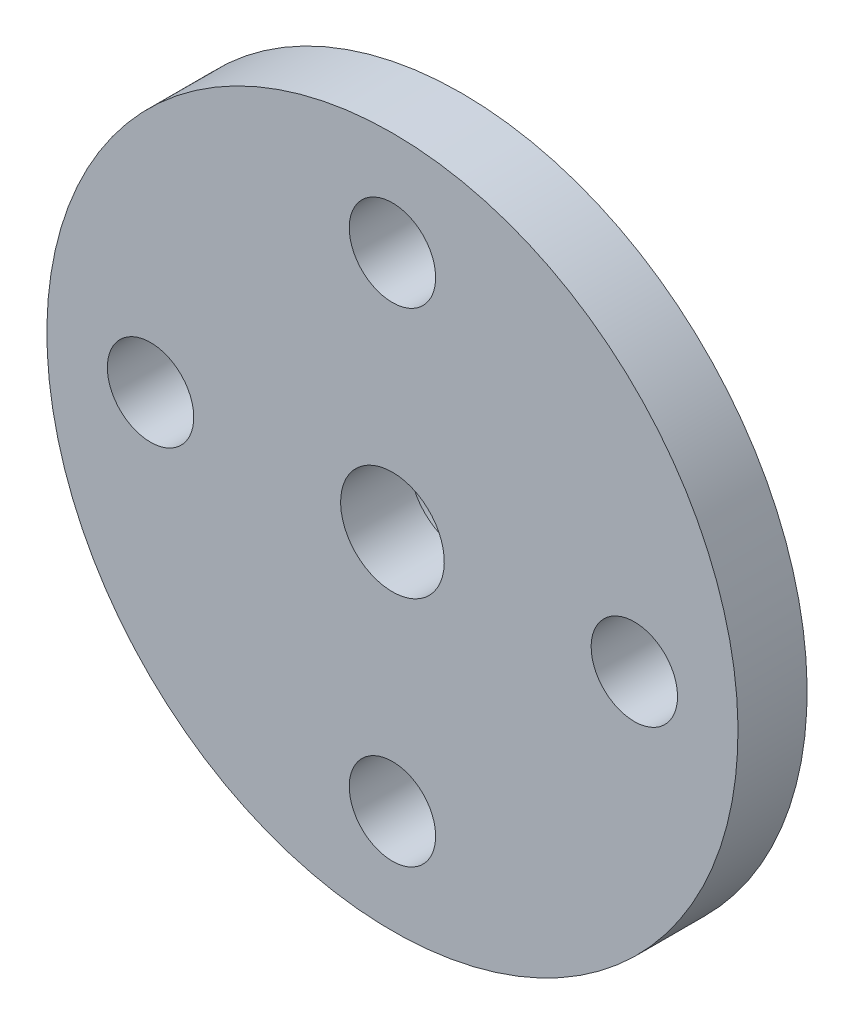
ISO-10303-21;
HEADER;
FILE_DESCRIPTION(('STEP AP214'),'2;1');
FILE_NAME('part.step','',(''),(''),'','','');
FILE_SCHEMA(('AUTOMOTIVE_DESIGN { 1 0 10303 214 1 1 1 1 }'));
ENDSEC;
DATA;
#1=APPLICATION_CONTEXT('core data for automotive mechanical design processes');
#2=APPLICATION_PROTOCOL_DEFINITION('international standard','automotive_design',2000,#1);
#3=PRODUCT_CONTEXT('',#1,'mechanical');
#4=PRODUCT('Part','Part','',(#3));
#5=PRODUCT_RELATED_PRODUCT_CATEGORY('part','',(#4));
#6=PRODUCT_DEFINITION_FORMATION('','',#4);
#7=PRODUCT_DEFINITION_CONTEXT('part definition',#1,'design');
#8=PRODUCT_DEFINITION('design','',#6,#7);
#9=PRODUCT_DEFINITION_SHAPE('','',#8);
#10=(LENGTH_UNIT() NAMED_UNIT(*) SI_UNIT(.MILLI.,.METRE.));
#11=(NAMED_UNIT(*) PLANE_ANGLE_UNIT() SI_UNIT($,.RADIAN.));
#12=(NAMED_UNIT(*) SI_UNIT($,.STERADIAN.) SOLID_ANGLE_UNIT());
#13=UNCERTAINTY_MEASURE_WITH_UNIT(LENGTH_MEASURE(1.E-05),#10,'distance_accuracy_value','');
#14=(GEOMETRIC_REPRESENTATION_CONTEXT(3) GLOBAL_UNCERTAINTY_ASSIGNED_CONTEXT((#13)) GLOBAL_UNIT_ASSIGNED_CONTEXT((#10,
#11,#12)) REPRESENTATION_CONTEXT('',''));
#15=CARTESIAN_POINT('',(0.,0.,0.));
#16=DIRECTION('',(0.,0.,1.));
#17=DIRECTION('',(1.,0.,0.));
#18=AXIS2_PLACEMENT_3D('',#15,#16,#17);
#19=CARTESIAN_POINT('',(0.,0.,0.));
#20=DIRECTION('',(0.,0.,-1.));
#21=DIRECTION('',(0.,1.,0.));
#22=AXIS2_PLACEMENT_3D('',#19,#20,#21);
#23=CYLINDRICAL_SURFACE('',#22,1.5);
#24=CARTESIAN_POINT('',(0.,0.,0.));
#25=DIRECTION('',(0.,0.,-1.));
#26=DIRECTION('',(0.,1.,0.));
#27=AXIS2_PLACEMENT_3D('',#24,#25,#26);
#28=CIRCLE('',#27,1.5);
#29=CARTESIAN_POINT('',(0.,1.5,0.));
#30=VERTEX_POINT('',#29);
#31=EDGE_CURVE('E60',#30,#30,#28,.T.);
#32=ORIENTED_EDGE('',*,*,#31,.T.);
#33=EDGE_LOOP('',(#32));
#34=FACE_BOUND('',#33,.T.);
#35=CARTESIAN_POINT('',(0.,0.,2.));
#36=DIRECTION('',(0.,0.,-1.));
#37=DIRECTION('',(0.,1.,0.));
#38=AXIS2_PLACEMENT_3D('',#35,#36,#37);
#39=CIRCLE('',#38,1.5);
#40=CARTESIAN_POINT('',(0.,1.5,2.));
#41=VERTEX_POINT('',#40);
#42=EDGE_CURVE('E10',#41,#41,#39,.T.);
#43=ORIENTED_EDGE('',*,*,#42,.F.);
#44=EDGE_LOOP('',(#43));
#45=FACE_BOUND('',#44,.T.);
#46=ADVANCED_FACE('F36',(#34,#45),#23,.F.);
#47=CARTESIAN_POINT('',(0.,1.5,2.));
#48=DIRECTION('',(0.,0.,1.));
#49=DIRECTION('',(0.,-1.,0.));
#50=AXIS2_PLACEMENT_3D('',#47,#48,#49);
#51=PLANE('',#50);
#52=CARTESIAN_POINT('',(-7.,0.,2.));
#53=DIRECTION('',(0.,0.,1.));
#54=DIRECTION('',(0.,-1.,0.));
#55=AXIS2_PLACEMENT_3D('',#52,#53,#54);
#56=CIRCLE('',#55,1.25);
#57=CARTESIAN_POINT('',(-7.,-1.24999999999993,2.));
#58=VERTEX_POINT('',#57);
#59=EDGE_CURVE('E74',#58,#58,#56,.T.);
#60=ORIENTED_EDGE('',*,*,#59,.F.);
#61=EDGE_LOOP('',(#60));
#62=FACE_BOUND('',#61,.T.);
#63=CARTESIAN_POINT('',(0.,-7.,2.));
#64=DIRECTION('',(0.,0.,1.));
#65=DIRECTION('',(0.,-1.,0.));
#66=AXIS2_PLACEMENT_3D('',#63,#64,#65);
#67=CIRCLE('',#66,1.25);
#68=CARTESIAN_POINT('',(0.,-8.25,2.));
#69=VERTEX_POINT('',#68);
#70=EDGE_CURVE('E62',#69,#69,#67,.T.);
#71=ORIENTED_EDGE('',*,*,#70,.F.);
#72=EDGE_LOOP('',(#71));
#73=FACE_BOUND('',#72,.T.);
#74=CARTESIAN_POINT('',(7.,0.,2.));
#75=DIRECTION('',(0.,0.,1.));
#76=DIRECTION('',(0.,-1.,0.));
#77=AXIS2_PLACEMENT_3D('',#74,#75,#76);
#78=CIRCLE('',#77,1.25);
#79=CARTESIAN_POINT('',(7.,-1.25000000000002,2.));
#80=VERTEX_POINT('',#79);
#81=EDGE_CURVE('E63',#80,#80,#78,.T.);
#82=ORIENTED_EDGE('',*,*,#81,.F.);
#83=EDGE_LOOP('',(#82));
#84=FACE_BOUND('',#83,.T.);
#85=CARTESIAN_POINT('',(0.,7.,2.));
#86=DIRECTION('',(0.,0.,1.));
#87=DIRECTION('',(0.,-1.,0.));
#88=AXIS2_PLACEMENT_3D('',#85,#86,#87);
#89=CIRCLE('',#88,1.25);
#90=CARTESIAN_POINT('',(0.,5.75,2.));
#91=VERTEX_POINT('',#90);
#92=EDGE_CURVE('E59',#91,#91,#89,.T.);
#93=ORIENTED_EDGE('',*,*,#92,.F.);
#94=EDGE_LOOP('',(#93));
#95=FACE_BOUND('',#94,.T.);
#96=ORIENTED_EDGE('',*,*,#42,.T.);
#97=EDGE_LOOP('',(#96));
#98=FACE_BOUND('',#97,.T.);
#99=CARTESIAN_POINT('',(0.,0.,2.));
#100=DIRECTION('',(0.,0.,-1.));
#101=DIRECTION('',(0.,1.,0.));
#102=AXIS2_PLACEMENT_3D('',#99,#100,#101);
#103=CIRCLE('',#102,10.);
#104=CARTESIAN_POINT('',(0.,10.,2.));
#105=VERTEX_POINT('',#104);
#106=EDGE_CURVE('E44',#105,#105,#103,.T.);
#107=ORIENTED_EDGE('',*,*,#106,.F.);
#108=EDGE_LOOP('',(#107));
#109=FACE_BOUND('',#108,.T.);
#110=ADVANCED_FACE('F99',(#62,#73,#84,#95,#98,#109),#51,.T.);
#111=CARTESIAN_POINT('',(0.,0.,0.));
#112=DIRECTION('',(0.,0.,-1.));
#113=DIRECTION('',(0.,1.,0.));
#114=AXIS2_PLACEMENT_3D('',#111,#112,#113);
#115=CYLINDRICAL_SURFACE('',#114,10.);
#116=ORIENTED_EDGE('',*,*,#106,.T.);
#117=EDGE_LOOP('',(#116));
#118=FACE_BOUND('',#117,.T.);
#119=CARTESIAN_POINT('',(0.,0.,0.));
#120=DIRECTION('',(0.,0.,-1.));
#121=DIRECTION('',(0.,1.,0.));
#122=AXIS2_PLACEMENT_3D('',#119,#120,#121);
#123=CIRCLE('',#122,10.);
#124=CARTESIAN_POINT('',(0.,10.,0.));
#125=VERTEX_POINT('',#124);
#126=EDGE_CURVE('E49',#125,#125,#123,.T.);
#127=ORIENTED_EDGE('',*,*,#126,.F.);
#128=EDGE_LOOP('',(#127));
#129=FACE_BOUND('',#128,.T.);
#130=ADVANCED_FACE('F98',(#118,#129),#115,.T.);
#131=CARTESIAN_POINT('',(0.,10.,0.));
#132=DIRECTION('',(0.,0.,-1.));
#133=DIRECTION('',(0.,1.,0.));
#134=AXIS2_PLACEMENT_3D('',#131,#132,#133);
#135=PLANE('',#134);
#136=CARTESIAN_POINT('',(-7.,0.,0.));
#137=DIRECTION('',(0.,0.,-1.));
#138=DIRECTION('',(0.,1.,0.));
#139=AXIS2_PLACEMENT_3D('',#136,#137,#138);
#140=CIRCLE('',#139,1.25);
#141=CARTESIAN_POINT('',(-7.,1.25000000000007,0.));
#142=VERTEX_POINT('',#141);
#143=EDGE_CURVE('E41',#142,#142,#140,.T.);
#144=ORIENTED_EDGE('',*,*,#143,.F.);
#145=EDGE_LOOP('',(#144));
#146=FACE_BOUND('',#145,.T.);
#147=CARTESIAN_POINT('',(0.,-7.,0.));
#148=DIRECTION('',(0.,0.,-1.));
#149=DIRECTION('',(0.,1.,0.));
#150=AXIS2_PLACEMENT_3D('',#147,#148,#149);
#151=CIRCLE('',#150,1.25);
#152=CARTESIAN_POINT('',(0.,-5.75,0.));
#153=VERTEX_POINT('',#152);
#154=EDGE_CURVE('E65',#153,#153,#151,.T.);
#155=ORIENTED_EDGE('',*,*,#154,.F.);
#156=EDGE_LOOP('',(#155));
#157=FACE_BOUND('',#156,.T.);
#158=CARTESIAN_POINT('',(7.,0.,0.));
#159=DIRECTION('',(0.,0.,-1.));
#160=DIRECTION('',(0.,1.,0.));
#161=AXIS2_PLACEMENT_3D('',#158,#159,#160);
#162=CIRCLE('',#161,1.25);
#163=CARTESIAN_POINT('',(7.,1.24999999999997,0.));
#164=VERTEX_POINT('',#163);
#165=EDGE_CURVE('E56',#164,#164,#162,.T.);
#166=ORIENTED_EDGE('',*,*,#165,.F.);
#167=EDGE_LOOP('',(#166));
#168=FACE_BOUND('',#167,.T.);
#169=CARTESIAN_POINT('',(0.,7.,0.));
#170=DIRECTION('',(0.,0.,-1.));
#171=DIRECTION('',(0.,1.,0.));
#172=AXIS2_PLACEMENT_3D('',#169,#170,#171);
#173=CIRCLE('',#172,1.25);
#174=CARTESIAN_POINT('',(0.,8.25,0.));
#175=VERTEX_POINT('',#174);
#176=EDGE_CURVE('E53',#175,#175,#173,.T.);
#177=ORIENTED_EDGE('',*,*,#176,.F.);
#178=EDGE_LOOP('',(#177));
#179=FACE_BOUND('',#178,.T.);
#180=ORIENTED_EDGE('',*,*,#126,.T.);
#181=EDGE_LOOP('',(#180));
#182=FACE_BOUND('',#181,.T.);
#183=CARTESIAN_POINT('',(0.,0.,0.));
#184=DIRECTION('',(0.,0.,-1.));
#185=DIRECTION('',(0.,1.,0.));
#186=AXIS2_PLACEMENT_3D('',#183,#184,#185);
#187=CIRCLE('',#186,5.);
#188=CARTESIAN_POINT('',(0.,5.,0.));
#189=VERTEX_POINT('',#188);
#190=EDGE_CURVE('E89',#189,#189,#187,.T.);
#191=ORIENTED_EDGE('',*,*,#190,.F.);
#192=EDGE_LOOP('',(#191));
#193=FACE_BOUND('',#192,.T.);
#194=ADVANCED_FACE('F92',(#146,#157,#168,#179,#182,#193),#135,.T.);
#195=CARTESIAN_POINT('',(0.,0.,0.));
#196=DIRECTION('',(0.,0.,-1.));
#197=DIRECTION('',(0.,1.,0.));
#198=AXIS2_PLACEMENT_3D('',#195,#196,#197);
#199=CYLINDRICAL_SURFACE('',#198,5.);
#200=ORIENTED_EDGE('',*,*,#190,.T.);
#201=EDGE_LOOP('',(#200));
#202=FACE_BOUND('',#201,.T.);
#203=CARTESIAN_POINT('',(0.,0.,-3.50000000000001));
#204=DIRECTION('',(0.,0.,-1.));
#205=DIRECTION('',(0.,1.,0.));
#206=AXIS2_PLACEMENT_3D('',#203,#204,#205);
#207=CIRCLE('',#206,5.);
#208=CARTESIAN_POINT('',(0.,5.,-3.50000000000001));
#209=VERTEX_POINT('',#208);
#210=EDGE_CURVE('E87',#209,#209,#207,.T.);
#211=ORIENTED_EDGE('',*,*,#210,.F.);
#212=EDGE_LOOP('',(#211));
#213=FACE_BOUND('',#212,.T.);
#214=ADVANCED_FACE('F107',(#202,#213),#199,.T.);
#215=CARTESIAN_POINT('',(0.,5.,-3.5));
#216=DIRECTION('',(0.,0.,-1.));
#217=DIRECTION('',(0.,1.,0.));
#218=AXIS2_PLACEMENT_3D('',#215,#216,#217);
#219=PLANE('',#218);
#220=ORIENTED_EDGE('',*,*,#210,.T.);
#221=EDGE_LOOP('',(#220));
#222=FACE_BOUND('',#221,.T.);
#223=CARTESIAN_POINT('',(0.,0.,-3.5));
#224=DIRECTION('',(0.,0.,-1.));
#225=DIRECTION('',(0.,1.,0.));
#226=AXIS2_PLACEMENT_3D('',#223,#224,#225);
#227=CIRCLE('',#226,3.);
#228=CARTESIAN_POINT('',(0.,3.,-3.5));
#229=VERTEX_POINT('',#228);
#230=EDGE_CURVE('E84',#229,#229,#227,.T.);
#231=ORIENTED_EDGE('',*,*,#230,.F.);
#232=EDGE_LOOP('',(#231));
#233=FACE_BOUND('',#232,.T.);
#234=ADVANCED_FACE('F135',(#222,#233),#219,.T.);
#235=CARTESIAN_POINT('',(0.,0.,0.));
#236=DIRECTION('',(0.,0.,-1.));
#237=DIRECTION('',(0.,1.,0.));
#238=AXIS2_PLACEMENT_3D('',#235,#236,#237);
#239=CYLINDRICAL_SURFACE('',#238,3.);
#240=ORIENTED_EDGE('',*,*,#230,.T.);
#241=EDGE_LOOP('',(#240));
#242=FACE_BOUND('',#241,.T.);
#243=CARTESIAN_POINT('',(0.,0.,0.));
#244=DIRECTION('',(0.,0.,-1.));
#245=DIRECTION('',(0.,1.,0.));
#246=AXIS2_PLACEMENT_3D('',#243,#244,#245);
#247=CIRCLE('',#246,3.);
#248=CARTESIAN_POINT('',(0.,3.,0.));
#249=VERTEX_POINT('',#248);
#250=EDGE_CURVE('E82',#249,#249,#247,.T.);
#251=ORIENTED_EDGE('',*,*,#250,.F.);
#252=EDGE_LOOP('',(#251));
#253=FACE_BOUND('',#252,.T.);
#254=ADVANCED_FACE('F125',(#242,#253),#239,.F.);
#255=CARTESIAN_POINT('',(0.,3.,0.));
#256=DIRECTION('',(0.,0.,-1.));
#257=DIRECTION('',(0.,1.,0.));
#258=AXIS2_PLACEMENT_3D('',#255,#256,#257);
#259=PLANE('',#258);
#260=ORIENTED_EDGE('',*,*,#250,.T.);
#261=EDGE_LOOP('',(#260));
#262=FACE_BOUND('',#261,.T.);
#263=ORIENTED_EDGE('',*,*,#31,.F.);
#264=EDGE_LOOP('',(#263));
#265=FACE_BOUND('',#264,.T.);
#266=ADVANCED_FACE('F117',(#262,#265),#259,.T.);
#267=CARTESIAN_POINT('',(0.,7.,2.));
#268=DIRECTION('',(0.,0.,1.));
#269=DIRECTION('',(0.,-1.,0.));
#270=AXIS2_PLACEMENT_3D('',#267,#268,#269);
#271=CYLINDRICAL_SURFACE('',#270,1.25);
#272=ORIENTED_EDGE('',*,*,#176,.T.);
#273=EDGE_LOOP('',(#272));
#274=FACE_BOUND('',#273,.T.);
#275=ORIENTED_EDGE('',*,*,#92,.T.);
#276=EDGE_LOOP('',(#275));
#277=FACE_BOUND('',#276,.T.);
#278=ADVANCED_FACE('F121',(#274,#277),#271,.F.);
#279=CARTESIAN_POINT('',(7.,0.,2.));
#280=DIRECTION('',(0.,0.,1.));
#281=DIRECTION('',(0.,-1.,0.));
#282=AXIS2_PLACEMENT_3D('',#279,#280,#281);
#283=CYLINDRICAL_SURFACE('',#282,1.25);
#284=ORIENTED_EDGE('',*,*,#165,.T.);
#285=EDGE_LOOP('',(#284));
#286=FACE_BOUND('',#285,.T.);
#287=ORIENTED_EDGE('',*,*,#81,.T.);
#288=EDGE_LOOP('',(#287));
#289=FACE_BOUND('',#288,.T.);
#290=ADVANCED_FACE('F128',(#286,#289),#283,.F.);
#291=CARTESIAN_POINT('',(0.,-7.,2.));
#292=DIRECTION('',(0.,0.,1.));
#293=DIRECTION('',(0.,-1.,0.));
#294=AXIS2_PLACEMENT_3D('',#291,#292,#293);
#295=CYLINDRICAL_SURFACE('',#294,1.25);
#296=ORIENTED_EDGE('',*,*,#154,.T.);
#297=EDGE_LOOP('',(#296));
#298=FACE_BOUND('',#297,.T.);
#299=ORIENTED_EDGE('',*,*,#70,.T.);
#300=EDGE_LOOP('',(#299));
#301=FACE_BOUND('',#300,.T.);
#302=ADVANCED_FACE('F181',(#298,#301),#295,.F.);
#303=CARTESIAN_POINT('',(-7.,0.,2.));
#304=DIRECTION('',(0.,0.,1.));
#305=DIRECTION('',(0.,-1.,0.));
#306=AXIS2_PLACEMENT_3D('',#303,#304,#305);
#307=CYLINDRICAL_SURFACE('',#306,1.25);
#308=ORIENTED_EDGE('',*,*,#143,.T.);
#309=EDGE_LOOP('',(#308));
#310=FACE_BOUND('',#309,.T.);
#311=ORIENTED_EDGE('',*,*,#59,.T.);
#312=EDGE_LOOP('',(#311));
#313=FACE_BOUND('',#312,.T.);
#314=ADVANCED_FACE('F193',(#310,#313),#307,.F.);
#315=CLOSED_SHELL('',(#46,#110,#130,#194,#214,#234,#254,#266,#278,#290,#302,#314));
#316=MANIFOLD_SOLID_BREP('B2',#315);
#317=ADVANCED_BREP_SHAPE_REPRESENTATION('',(#18,#316),#14);
#318=SHAPE_DEFINITION_REPRESENTATION(#9,#317);
ENDSEC;
END-ISO-10303-21;
